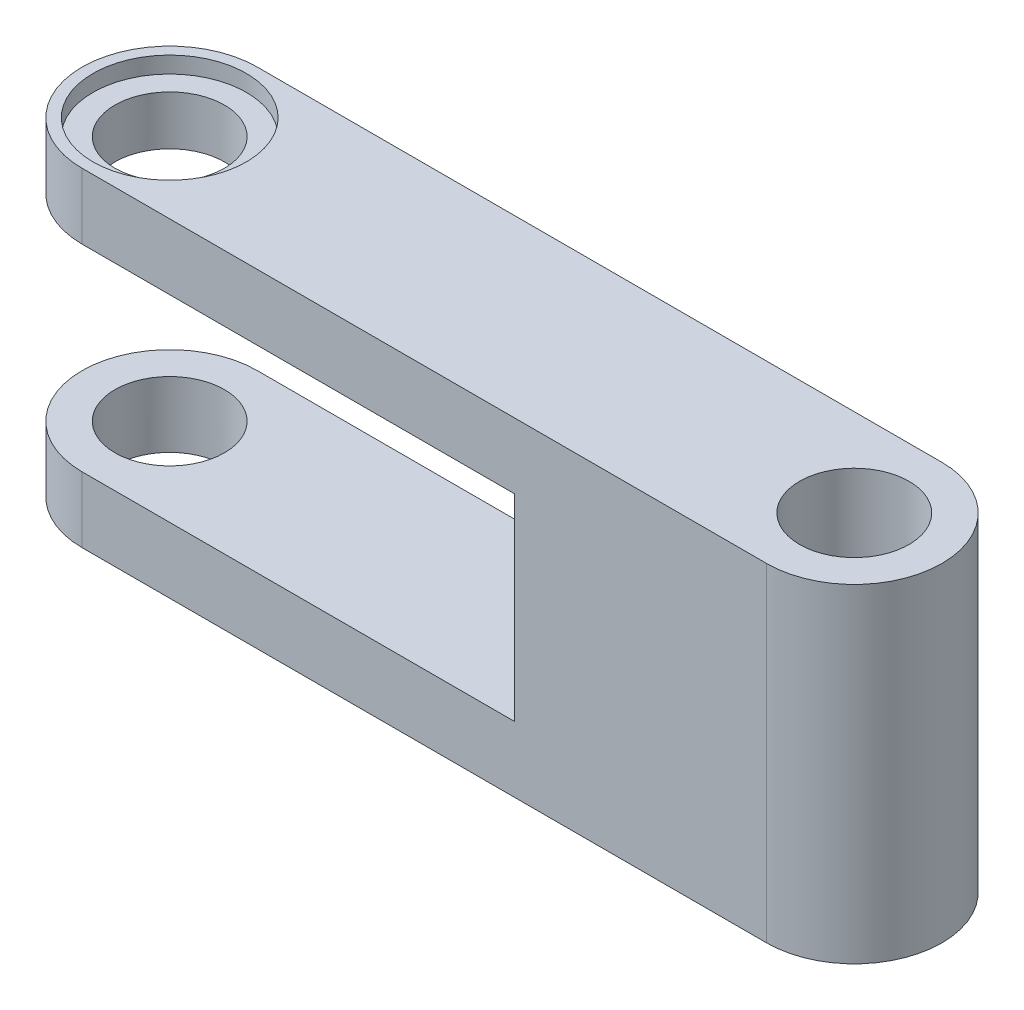
ISO-10303-21;
HEADER;
FILE_DESCRIPTION(('STEP AP214'),'2;1');
FILE_NAME('part.step','',(''),(''),'','','');
FILE_SCHEMA(('AUTOMOTIVE_DESIGN { 1 0 10303 214 1 1 1 1 }'));
ENDSEC;
DATA;
#1=APPLICATION_CONTEXT('core data for automotive mechanical design processes');
#2=APPLICATION_PROTOCOL_DEFINITION('international standard','automotive_design',2000,#1);
#3=PRODUCT_CONTEXT('',#1,'mechanical');
#4=PRODUCT('Part','Part','',(#3));
#5=PRODUCT_RELATED_PRODUCT_CATEGORY('part','',(#4));
#6=PRODUCT_DEFINITION_FORMATION('','',#4);
#7=PRODUCT_DEFINITION_CONTEXT('part definition',#1,'design');
#8=PRODUCT_DEFINITION('design','',#6,#7);
#9=PRODUCT_DEFINITION_SHAPE('','',#8);
#10=(LENGTH_UNIT() NAMED_UNIT(*) SI_UNIT(.MILLI.,.METRE.));
#11=(NAMED_UNIT(*) PLANE_ANGLE_UNIT() SI_UNIT($,.RADIAN.));
#12=(NAMED_UNIT(*) SI_UNIT($,.STERADIAN.) SOLID_ANGLE_UNIT());
#13=UNCERTAINTY_MEASURE_WITH_UNIT(LENGTH_MEASURE(1.E-05),#10,'distance_accuracy_value','');
#14=(GEOMETRIC_REPRESENTATION_CONTEXT(3) GLOBAL_UNCERTAINTY_ASSIGNED_CONTEXT((#13)) GLOBAL_UNIT_ASSIGNED_CONTEXT((#10,
#11,#12)) REPRESENTATION_CONTEXT('',''));
#15=CARTESIAN_POINT('',(0.,0.,0.));
#16=DIRECTION('',(0.,0.,1.));
#17=DIRECTION('',(1.,0.,0.));
#18=AXIS2_PLACEMENT_3D('',#15,#16,#17);
#19=CARTESIAN_POINT('',(-62.5,-0.001000000000001,0.));
#20=DIRECTION('',(0.,1.,0.));
#21=DIRECTION('',(0.,0.,1.));
#22=AXIS2_PLACEMENT_3D('',#19,#20,#21);
#23=CYLINDRICAL_SURFACE('',#22,10.);
#24=CARTESIAN_POINT('',(-62.5,48.,0.));
#25=DIRECTION('',(0.,1.,0.));
#26=DIRECTION('',(-1.,0.,0.));
#27=AXIS2_PLACEMENT_3D('',#24,#25,#26);
#28=CIRCLE('',#27,10.);
#29=CARTESIAN_POINT('',(-72.5,48.,0.));
#30=VERTEX_POINT('',#29);
#31=EDGE_CURVE('E331',#30,#30,#28,.T.);
#32=ORIENTED_EDGE('',*,*,#31,.F.);
#33=EDGE_LOOP('',(#32));
#34=FACE_BOUND('',#33,.T.);
#35=CARTESIAN_POINT('',(-62.5,57.,0.));
#36=DIRECTION('',(0.,1.,0.));
#37=DIRECTION('',(0.,0.,1.));
#38=AXIS2_PLACEMENT_3D('',#35,#36,#37);
#39=CIRCLE('',#38,10.);
#40=CARTESIAN_POINT('',(-62.5,57.,10.));
#41=VERTEX_POINT('',#40);
#42=EDGE_CURVE('E39',#41,#41,#39,.F.);
#43=ORIENTED_EDGE('',*,*,#42,.F.);
#44=EDGE_LOOP('',(#43));
#45=FACE_BOUND('',#44,.T.);
#46=ADVANCED_FACE('F35',(#34,#45),#23,.F.);
#47=CARTESIAN_POINT('',(-62.5,60.,0.));
#48=DIRECTION('',(0.,-1.,0.));
#49=DIRECTION('',(0.,0.,-1.));
#50=AXIS2_PLACEMENT_3D('',#47,#48,#49);
#51=CYLINDRICAL_SURFACE('',#50,16.);
#52=DIRECTION('',(0.,-1.,0.));
#53=VECTOR('',#52,1.);
#54=CARTESIAN_POINT('',(-62.5,60.,-16.));
#55=LINE('',#54,#53);
#56=CARTESIAN_POINT('',(-62.5,60.,-16.));
#57=VERTEX_POINT('',#56);
#58=CARTESIAN_POINT('',(-62.5,48.,-16.));
#59=VERTEX_POINT('',#58);
#60=EDGE_CURVE('E128',#57,#59,#55,.T.);
#61=ORIENTED_EDGE('',*,*,#60,.T.);
#62=CARTESIAN_POINT('',(-62.5,48.,0.));
#63=DIRECTION('',(0.,1.,0.));
#64=DIRECTION('',(-1.,0.,0.));
#65=AXIS2_PLACEMENT_3D('',#62,#63,#64);
#66=CIRCLE('',#65,16.);
#67=CARTESIAN_POINT('',(-62.5,48.,16.));
#68=VERTEX_POINT('',#67);
#69=EDGE_CURVE('E115',#68,#59,#66,.F.);
#70=ORIENTED_EDGE('',*,*,#69,.F.);
#71=DIRECTION('',(0.,-1.,0.));
#72=VECTOR('',#71,1.);
#73=CARTESIAN_POINT('',(-62.5,60.,16.));
#74=LINE('',#73,#72);
#75=CARTESIAN_POINT('',(-62.5,60.,16.));
#76=VERTEX_POINT('',#75);
#77=EDGE_CURVE('E11',#76,#68,#74,.T.);
#78=ORIENTED_EDGE('',*,*,#77,.F.);
#79=CARTESIAN_POINT('',(-62.5,60.,0.));
#80=DIRECTION('',(0.,1.,0.));
#81=DIRECTION('',(0.,0.,1.));
#82=AXIS2_PLACEMENT_3D('',#79,#80,#81);
#83=CIRCLE('',#82,16.);
#84=EDGE_CURVE('E178',#57,#76,#83,.T.);
#85=ORIENTED_EDGE('',*,*,#84,.F.);
#86=EDGE_LOOP('',(#61,#70,#78,#85));
#87=FACE_BOUND('',#86,.T.);
#88=ADVANCED_FACE('F126',(#87),#51,.T.);
#89=CARTESIAN_POINT('',(-62.5,12.,0.));
#90=DIRECTION('',(0.,-1.,0.));
#91=DIRECTION('',(1.,0.,0.));
#92=AXIS2_PLACEMENT_3D('',#89,#90,#91);
#93=CIRCLE('',#92,10.);
#94=CARTESIAN_POINT('',(-52.5,12.,0.));
#95=VERTEX_POINT('',#94);
#96=EDGE_CURVE('E159',#95,#95,#93,.T.);
#97=ORIENTED_EDGE('',*,*,#96,.F.);
#98=EDGE_LOOP('',(#97));
#99=FACE_BOUND('',#98,.T.);
#100=CARTESIAN_POINT('',(-62.5,0.,0.));
#101=DIRECTION('',(0.,1.,0.));
#102=DIRECTION('',(0.,0.,1.));
#103=AXIS2_PLACEMENT_3D('',#100,#101,#102);
#104=CIRCLE('',#103,10.);
#105=CARTESIAN_POINT('',(-62.5,0.,10.));
#106=VERTEX_POINT('',#105);
#107=EDGE_CURVE('E162',#106,#106,#104,.F.);
#108=ORIENTED_EDGE('',*,*,#107,.T.);
#109=EDGE_LOOP('',(#108));
#110=FACE_BOUND('',#109,.T.);
#111=ADVANCED_FACE('F141',(#99,#110),#23,.F.);
#112=CARTESIAN_POINT('',(-62.5,12.,16.));
#113=VERTEX_POINT('',#112);
#114=CARTESIAN_POINT('',(-62.5,0.,16.));
#115=VERTEX_POINT('',#114);
#116=EDGE_CURVE('E44',#113,#115,#74,.T.);
#117=ORIENTED_EDGE('',*,*,#116,.F.);
#118=CARTESIAN_POINT('',(-62.5,12.,0.));
#119=DIRECTION('',(0.,-1.,0.));
#120=DIRECTION('',(1.,0.,0.));
#121=AXIS2_PLACEMENT_3D('',#118,#119,#120);
#122=CIRCLE('',#121,16.);
#123=CARTESIAN_POINT('',(-62.5,12.,-16.));
#124=VERTEX_POINT('',#123);
#125=EDGE_CURVE('E129',#124,#113,#122,.F.);
#126=ORIENTED_EDGE('',*,*,#125,.F.);
#127=CARTESIAN_POINT('',(-62.5,0.,-16.));
#128=VERTEX_POINT('',#127);
#129=EDGE_CURVE('E82',#124,#128,#55,.T.);
#130=ORIENTED_EDGE('',*,*,#129,.T.);
#131=CARTESIAN_POINT('',(-62.5,0.,0.));
#132=DIRECTION('',(0.,1.,0.));
#133=DIRECTION('',(0.,0.,1.));
#134=AXIS2_PLACEMENT_3D('',#131,#132,#133);
#135=CIRCLE('',#134,16.);
#136=EDGE_CURVE('E177',#128,#115,#135,.T.);
#137=ORIENTED_EDGE('',*,*,#136,.T.);
#138=EDGE_LOOP('',(#117,#126,#130,#137));
#139=FACE_BOUND('',#138,.T.);
#140=ADVANCED_FACE('F37',(#139),#51,.T.);
#141=CARTESIAN_POINT('',(-62.5,60.,16.));
#142=DIRECTION('',(0.,0.,-1.));
#143=DIRECTION('',(-1.,0.,0.));
#144=AXIS2_PLACEMENT_3D('',#141,#142,#143);
#145=PLANE('',#144);
#146=ORIENTED_EDGE('',*,*,#77,.T.);
#147=DIRECTION('',(-1.,0.,0.));
#148=VECTOR('',#147,1.);
#149=CARTESIAN_POINT('',(16.5,48.,16.));
#150=LINE('',#149,#148);
#151=CARTESIAN_POINT('',(16.5,48.,16.));
#152=VERTEX_POINT('',#151);
#153=EDGE_CURVE('E110',#152,#68,#150,.T.);
#154=ORIENTED_EDGE('',*,*,#153,.F.);
#155=DIRECTION('',(0.,1.,0.));
#156=VECTOR('',#155,1.);
#157=CARTESIAN_POINT('',(16.5,48.,16.));
#158=LINE('',#157,#156);
#159=CARTESIAN_POINT('',(16.5,12.,16.));
#160=VERTEX_POINT('',#159);
#161=EDGE_CURVE('E121',#160,#152,#158,.T.);
#162=ORIENTED_EDGE('',*,*,#161,.F.);
#163=DIRECTION('',(1.,0.,0.));
#164=VECTOR('',#163,1.);
#165=CARTESIAN_POINT('',(16.5,12.,16.));
#166=LINE('',#165,#164);
#167=EDGE_CURVE('E203',#113,#160,#166,.T.);
#168=ORIENTED_EDGE('',*,*,#167,.F.);
#169=ORIENTED_EDGE('',*,*,#116,.T.);
#170=DIRECTION('',(1.,0.,0.));
#171=VECTOR('',#170,1.);
#172=CARTESIAN_POINT('',(-62.5,0.,16.));
#173=LINE('',#172,#171);
#174=CARTESIAN_POINT('',(62.5,0.,16.));
#175=VERTEX_POINT('',#174);
#176=EDGE_CURVE('E186',#115,#175,#173,.T.);
#177=ORIENTED_EDGE('',*,*,#176,.T.);
#178=DIRECTION('',(0.,-1.,0.));
#179=VECTOR('',#178,1.);
#180=CARTESIAN_POINT('',(62.5,60.,16.));
#181=LINE('',#180,#179);
#182=CARTESIAN_POINT('',(62.5,60.,16.));
#183=VERTEX_POINT('',#182);
#184=EDGE_CURVE('E195',#183,#175,#181,.T.);
#185=ORIENTED_EDGE('',*,*,#184,.F.);
#186=DIRECTION('',(1.,0.,0.));
#187=VECTOR('',#186,1.);
#188=CARTESIAN_POINT('',(-62.5,60.,16.));
#189=LINE('',#188,#187);
#190=EDGE_CURVE('E89',#76,#183,#189,.T.);
#191=ORIENTED_EDGE('',*,*,#190,.F.);
#192=EDGE_LOOP('',(#146,#154,#162,#168,#169,#177,#185,#191));
#193=FACE_BOUND('',#192,.T.);
#194=ADVANCED_FACE('F131',(#193),#145,.F.);
#195=CARTESIAN_POINT('',(62.5,60.,0.));
#196=DIRECTION('',(0.,-1.,0.));
#197=DIRECTION('',(0.,0.,-1.));
#198=AXIS2_PLACEMENT_3D('',#195,#196,#197);
#199=CYLINDRICAL_SURFACE('',#198,16.);
#200=CARTESIAN_POINT('',(62.5,0.,0.));
#201=DIRECTION('',(0.,1.,0.));
#202=DIRECTION('',(0.,0.,1.));
#203=AXIS2_PLACEMENT_3D('',#200,#201,#202);
#204=CIRCLE('',#203,16.);
#205=CARTESIAN_POINT('',(62.5,0.,-16.));
#206=VERTEX_POINT('',#205);
#207=EDGE_CURVE('E188',#175,#206,#204,.T.);
#208=ORIENTED_EDGE('',*,*,#207,.T.);
#209=DIRECTION('',(0.,-1.,0.));
#210=VECTOR('',#209,1.);
#211=CARTESIAN_POINT('',(62.5,60.,-16.));
#212=LINE('',#211,#210);
#213=CARTESIAN_POINT('',(62.5,60.,-16.));
#214=VERTEX_POINT('',#213);
#215=EDGE_CURVE('E192',#214,#206,#212,.T.);
#216=ORIENTED_EDGE('',*,*,#215,.F.);
#217=CARTESIAN_POINT('',(62.5,60.,0.));
#218=DIRECTION('',(0.,1.,0.));
#219=DIRECTION('',(0.,0.,1.));
#220=AXIS2_PLACEMENT_3D('',#217,#218,#219);
#221=CIRCLE('',#220,16.);
#222=EDGE_CURVE('E182',#183,#214,#221,.T.);
#223=ORIENTED_EDGE('',*,*,#222,.F.);
#224=ORIENTED_EDGE('',*,*,#184,.T.);
#225=EDGE_LOOP('',(#208,#216,#223,#224));
#226=FACE_BOUND('',#225,.T.);
#227=ADVANCED_FACE('F133',(#226),#199,.T.);
#228=CARTESIAN_POINT('',(-62.5,60.,-16.));
#229=DIRECTION('',(0.,0.,1.));
#230=DIRECTION('',(1.,0.,0.));
#231=AXIS2_PLACEMENT_3D('',#228,#229,#230);
#232=PLANE('',#231);
#233=DIRECTION('',(0.,-1.,0.));
#234=VECTOR('',#233,1.);
#235=CARTESIAN_POINT('',(16.5,48.,-16.));
#236=LINE('',#235,#234);
#237=CARTESIAN_POINT('',(16.5,48.,-16.));
#238=VERTEX_POINT('',#237);
#239=CARTESIAN_POINT('',(16.5,12.,-16.));
#240=VERTEX_POINT('',#239);
#241=EDGE_CURVE('E51',#238,#240,#236,.T.);
#242=ORIENTED_EDGE('',*,*,#241,.F.);
#243=DIRECTION('',(1.,0.,0.));
#244=VECTOR('',#243,1.);
#245=CARTESIAN_POINT('',(16.5,48.,-16.));
#246=LINE('',#245,#244);
#247=EDGE_CURVE('E210',#59,#238,#246,.T.);
#248=ORIENTED_EDGE('',*,*,#247,.F.);
#249=ORIENTED_EDGE('',*,*,#60,.F.);
#250=DIRECTION('',(-1.,0.,0.));
#251=VECTOR('',#250,1.);
#252=CARTESIAN_POINT('',(-62.5,60.,-16.));
#253=LINE('',#252,#251);
#254=EDGE_CURVE('E60',#214,#57,#253,.T.);
#255=ORIENTED_EDGE('',*,*,#254,.F.);
#256=ORIENTED_EDGE('',*,*,#215,.T.);
#257=DIRECTION('',(-1.,0.,0.));
#258=VECTOR('',#257,1.);
#259=CARTESIAN_POINT('',(-62.5,0.,-16.));
#260=LINE('',#259,#258);
#261=EDGE_CURVE('E180',#206,#128,#260,.T.);
#262=ORIENTED_EDGE('',*,*,#261,.T.);
#263=ORIENTED_EDGE('',*,*,#129,.F.);
#264=DIRECTION('',(-1.,0.,0.));
#265=VECTOR('',#264,1.);
#266=CARTESIAN_POINT('',(16.5,12.,-16.));
#267=LINE('',#266,#265);
#268=EDGE_CURVE('E332',#240,#124,#267,.T.);
#269=ORIENTED_EDGE('',*,*,#268,.F.);
#270=EDGE_LOOP('',(#242,#248,#249,#255,#256,#262,#263,#269));
#271=FACE_BOUND('',#270,.T.);
#272=ADVANCED_FACE('F138',(#271),#232,.F.);
#273=CARTESIAN_POINT('',(-62.5,60.,0.));
#274=DIRECTION('',(0.,1.,0.));
#275=DIRECTION('',(0.,0.,1.));
#276=AXIS2_PLACEMENT_3D('',#273,#274,#275);
#277=PLANE('',#276);
#278=CARTESIAN_POINT('',(-62.5,60.,0.));
#279=DIRECTION('',(0.,1.,0.));
#280=DIRECTION('',(0.,0.,1.));
#281=AXIS2_PLACEMENT_3D('',#278,#279,#280);
#282=CIRCLE('',#281,14.);
#283=CARTESIAN_POINT('',(-62.5,60.,14.));
#284=VERTEX_POINT('',#283);
#285=EDGE_CURVE('E172',#284,#284,#282,.T.);
#286=ORIENTED_EDGE('',*,*,#285,.F.);
#287=EDGE_LOOP('',(#286));
#288=FACE_BOUND('',#287,.T.);
#289=CARTESIAN_POINT('',(62.5,60.,0.));
#290=DIRECTION('',(0.,1.,0.));
#291=DIRECTION('',(0.,0.,1.));
#292=AXIS2_PLACEMENT_3D('',#289,#290,#291);
#293=CIRCLE('',#292,9.99999999999999);
#294=CARTESIAN_POINT('',(62.5,60.,9.99999999999997));
#295=VERTEX_POINT('',#294);
#296=EDGE_CURVE('E164',#295,#295,#293,.T.);
#297=ORIENTED_EDGE('',*,*,#296,.F.);
#298=EDGE_LOOP('',(#297));
#299=FACE_BOUND('',#298,.T.);
#300=ORIENTED_EDGE('',*,*,#84,.T.);
#301=ORIENTED_EDGE('',*,*,#190,.T.);
#302=ORIENTED_EDGE('',*,*,#222,.T.);
#303=ORIENTED_EDGE('',*,*,#254,.T.);
#304=EDGE_LOOP('',(#300,#301,#302,#303));
#305=FACE_BOUND('',#304,.T.);
#306=ADVANCED_FACE('F211',(#288,#299,#305),#277,.T.);
#307=CARTESIAN_POINT('',(-62.5,0.,0.));
#308=DIRECTION('',(0.,1.,0.));
#309=DIRECTION('',(0.,0.,1.));
#310=AXIS2_PLACEMENT_3D('',#307,#308,#309);
#311=PLANE('',#310);
#312=ORIENTED_EDGE('',*,*,#107,.F.);
#313=EDGE_LOOP('',(#312));
#314=FACE_BOUND('',#313,.T.);
#315=CARTESIAN_POINT('',(62.5,0.,0.));
#316=DIRECTION('',(0.,1.,0.));
#317=DIRECTION('',(0.,0.,1.));
#318=AXIS2_PLACEMENT_3D('',#315,#316,#317);
#319=CIRCLE('',#318,9.99999999999999);
#320=CARTESIAN_POINT('',(62.5,0.,9.99999999999997));
#321=VERTEX_POINT('',#320);
#322=EDGE_CURVE('E167',#321,#321,#319,.F.);
#323=ORIENTED_EDGE('',*,*,#322,.F.);
#324=EDGE_LOOP('',(#323));
#325=FACE_BOUND('',#324,.T.);
#326=ORIENTED_EDGE('',*,*,#136,.F.);
#327=ORIENTED_EDGE('',*,*,#261,.F.);
#328=ORIENTED_EDGE('',*,*,#207,.F.);
#329=ORIENTED_EDGE('',*,*,#176,.F.);
#330=EDGE_LOOP('',(#326,#327,#328,#329));
#331=FACE_BOUND('',#330,.T.);
#332=ADVANCED_FACE('F206',(#314,#325,#331),#311,.F.);
#333=CARTESIAN_POINT('',(62.5,-0.001000000000001,0.));
#334=DIRECTION('',(0.,1.,0.));
#335=DIRECTION('',(0.,0.,1.));
#336=AXIS2_PLACEMENT_3D('',#333,#334,#335);
#337=CYLINDRICAL_SURFACE('',#336,9.99999999999999);
#338=ORIENTED_EDGE('',*,*,#296,.T.);
#339=EDGE_LOOP('',(#338));
#340=FACE_BOUND('',#339,.T.);
#341=ORIENTED_EDGE('',*,*,#322,.T.);
#342=EDGE_LOOP('',(#341));
#343=FACE_BOUND('',#342,.T.);
#344=ADVANCED_FACE('F219',(#340,#343),#337,.F.);
#345=CARTESIAN_POINT('',(-62.5,57.,0.));
#346=DIRECTION('',(0.,1.,0.));
#347=DIRECTION('',(0.,0.,1.));
#348=AXIS2_PLACEMENT_3D('',#345,#346,#347);
#349=PLANE('',#348);
#350=CARTESIAN_POINT('',(-62.5,57.,0.));
#351=DIRECTION('',(0.,1.,0.));
#352=DIRECTION('',(0.,0.,1.));
#353=AXIS2_PLACEMENT_3D('',#350,#351,#352);
#354=CIRCLE('',#353,14.);
#355=CARTESIAN_POINT('',(-62.5,57.,14.));
#356=VERTEX_POINT('',#355);
#357=EDGE_CURVE('E170',#356,#356,#354,.T.);
#358=ORIENTED_EDGE('',*,*,#357,.T.);
#359=EDGE_LOOP('',(#358));
#360=FACE_BOUND('',#359,.T.);
#361=ORIENTED_EDGE('',*,*,#42,.T.);
#362=EDGE_LOOP('',(#361));
#363=FACE_BOUND('',#362,.T.);
#364=ADVANCED_FACE('F225',(#360,#363),#349,.T.);
#365=CARTESIAN_POINT('',(-62.5,57.,0.));
#366=DIRECTION('',(0.,1.,0.));
#367=DIRECTION('',(0.,0.,1.));
#368=AXIS2_PLACEMENT_3D('',#365,#366,#367);
#369=CYLINDRICAL_SURFACE('',#368,14.);
#370=ORIENTED_EDGE('',*,*,#357,.F.);
#371=EDGE_LOOP('',(#370));
#372=FACE_BOUND('',#371,.T.);
#373=ORIENTED_EDGE('',*,*,#285,.T.);
#374=EDGE_LOOP('',(#373));
#375=FACE_BOUND('',#374,.T.);
#376=ADVANCED_FACE('F230',(#372,#375),#369,.F.);
#377=CARTESIAN_POINT('',(16.5,48.,-16.001));
#378=DIRECTION('',(0.,1.,0.));
#379=DIRECTION('',(-1.,0.,0.));
#380=AXIS2_PLACEMENT_3D('',#377,#378,#379);
#381=PLANE('',#380);
#382=ORIENTED_EDGE('',*,*,#69,.T.);
#383=ORIENTED_EDGE('',*,*,#247,.T.);
#384=DIRECTION('',(0.,0.,1.));
#385=VECTOR('',#384,1.);
#386=CARTESIAN_POINT('',(16.5,48.,-16.001));
#387=LINE('',#386,#385);
#388=EDGE_CURVE('E117',#238,#152,#387,.T.);
#389=ORIENTED_EDGE('',*,*,#388,.T.);
#390=ORIENTED_EDGE('',*,*,#153,.T.);
#391=EDGE_LOOP('',(#382,#383,#389,#390));
#392=FACE_BOUND('',#391,.T.);
#393=ORIENTED_EDGE('',*,*,#31,.T.);
#394=EDGE_LOOP('',(#393));
#395=FACE_BOUND('',#394,.T.);
#396=ADVANCED_FACE('F112',(#392,#395),#381,.F.);
#397=CARTESIAN_POINT('',(16.5,48.,-16.001));
#398=DIRECTION('',(1.,0.,0.));
#399=DIRECTION('',(0.,0.,-1.));
#400=AXIS2_PLACEMENT_3D('',#397,#398,#399);
#401=PLANE('',#400);
#402=ORIENTED_EDGE('',*,*,#241,.T.);
#403=DIRECTION('',(0.,0.,1.));
#404=VECTOR('',#403,1.);
#405=CARTESIAN_POINT('',(16.5,12.,-16.001));
#406=LINE('',#405,#404);
#407=EDGE_CURVE('E120',#240,#160,#406,.T.);
#408=ORIENTED_EDGE('',*,*,#407,.T.);
#409=ORIENTED_EDGE('',*,*,#161,.T.);
#410=ORIENTED_EDGE('',*,*,#388,.F.);
#411=EDGE_LOOP('',(#402,#408,#409,#410));
#412=FACE_BOUND('',#411,.T.);
#413=ADVANCED_FACE('F247',(#412),#401,.F.);
#414=CARTESIAN_POINT('',(16.5,12.,-16.001));
#415=DIRECTION('',(0.,-1.,0.));
#416=DIRECTION('',(1.,0.,0.));
#417=AXIS2_PLACEMENT_3D('',#414,#415,#416);
#418=PLANE('',#417);
#419=ORIENTED_EDGE('',*,*,#125,.T.);
#420=ORIENTED_EDGE('',*,*,#167,.T.);
#421=ORIENTED_EDGE('',*,*,#407,.F.);
#422=ORIENTED_EDGE('',*,*,#268,.T.);
#423=EDGE_LOOP('',(#419,#420,#421,#422));
#424=FACE_BOUND('',#423,.T.);
#425=ORIENTED_EDGE('',*,*,#96,.T.);
#426=EDGE_LOOP('',(#425));
#427=FACE_BOUND('',#426,.T.);
#428=ADVANCED_FACE('F244',(#424,#427),#418,.F.);
#429=CLOSED_SHELL('',(#46,#88,#111,#140,#194,#227,#272,#306,#332,#344,#364,#376,#396,#413,#428));
#430=MANIFOLD_SOLID_BREP('B2',#429);
#431=ADVANCED_BREP_SHAPE_REPRESENTATION('',(#18,#430),#14);
#432=SHAPE_DEFINITION_REPRESENTATION(#9,#431);
ENDSEC;
END-ISO-10303-21;
